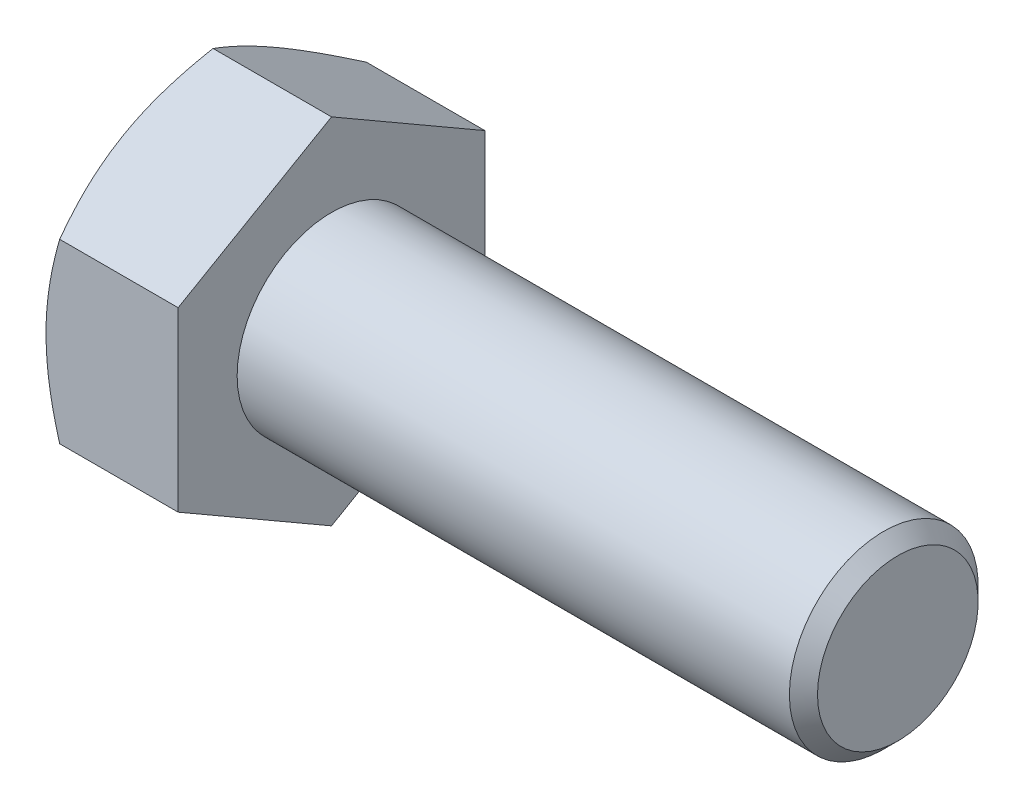
ISO-10303-21;
HEADER;
FILE_DESCRIPTION(('STEP AP214'),'2;1');
FILE_NAME('part.step','',(''),(''),'','','');
FILE_SCHEMA(('AUTOMOTIVE_DESIGN { 1 0 10303 214 1 1 1 1 }'));
ENDSEC;
DATA;
#1=APPLICATION_CONTEXT('core data for automotive mechanical design processes');
#2=APPLICATION_PROTOCOL_DEFINITION('international standard','automotive_design',2000,#1);
#3=PRODUCT_CONTEXT('',#1,'mechanical');
#4=PRODUCT('Part','Part','',(#3));
#5=PRODUCT_RELATED_PRODUCT_CATEGORY('part','',(#4));
#6=PRODUCT_DEFINITION_FORMATION('','',#4);
#7=PRODUCT_DEFINITION_CONTEXT('part definition',#1,'design');
#8=PRODUCT_DEFINITION('design','',#6,#7);
#9=PRODUCT_DEFINITION_SHAPE('','',#8);
#10=(LENGTH_UNIT() NAMED_UNIT(*) SI_UNIT(.MILLI.,.METRE.));
#11=(NAMED_UNIT(*) PLANE_ANGLE_UNIT() SI_UNIT($,.RADIAN.));
#12=(NAMED_UNIT(*) SI_UNIT($,.STERADIAN.) SOLID_ANGLE_UNIT());
#13=UNCERTAINTY_MEASURE_WITH_UNIT(LENGTH_MEASURE(1.E-05),#10,'distance_accuracy_value','');
#14=(GEOMETRIC_REPRESENTATION_CONTEXT(3) GLOBAL_UNCERTAINTY_ASSIGNED_CONTEXT((#13)) GLOBAL_UNIT_ASSIGNED_CONTEXT((#10,
#11,#12)) REPRESENTATION_CONTEXT('',''));
#15=CARTESIAN_POINT('',(0.,0.,0.));
#16=DIRECTION('',(0.,0.,1.));
#17=DIRECTION('',(1.,0.,0.));
#18=AXIS2_PLACEMENT_3D('',#15,#16,#17);
#19=CARTESIAN_POINT('',(-17.9582411472748,25.7612770285793,9.97950950033569));
#20=DIRECTION('',(0.,-0.866025403784438,0.500000000000001));
#21=DIRECTION('',(0.,-0.500000000000001,-0.866025403784438));
#22=AXIS2_PLACEMENT_3D('',#19,#20,#21);
#23=PLANE('',#22);
#24=CARTESIAN_POINT('',(-18.9542827835196,26.5059758817327,11.2693657503357));
#25=CARTESIAN_POINT('',(-18.973182209734,26.4732510725458,11.212684718156));
#26=CARTESIAN_POINT('',(-18.9903703010223,26.4402437835398,11.1555144165775));
#27=CARTESIAN_POINT('',(-19.0203717180975,26.3736576964694,11.0401839306944));
#28=CARTESIAN_POINT('',(-19.0331744314711,26.3400777156107,10.9820216977298));
#29=CARTESIAN_POINT('',(-19.0531029419838,26.2733338974192,10.8664180135311));
#30=CARTESIAN_POINT('',(-19.0603613870872,26.2401803270976,10.8089943452818));
#31=CARTESIAN_POINT('',(-19.0690251190552,26.1737172550244,10.6938769276239));
#32=CARTESIAN_POINT('',(-19.0704375816595,26.1404079947113,10.636183596399));
#33=CARTESIAN_POINT('',(-19.067492985651,26.0781722639128,10.5283881486098));
#34=CARTESIAN_POINT('',(-19.0638589233558,26.0492364583945,10.4782698632943));
#35=CARTESIAN_POINT('',(-19.0523430004584,25.9915533563113,10.378359799748));
#36=CARTESIAN_POINT('',(-19.0444572092083,25.9628062591346,10.3285683668678));
#37=CARTESIAN_POINT('',(-19.0247440970353,25.9050043070927,10.2284524491546));
#38=CARTESIAN_POINT('',(-19.0128332455615,25.8759567648255,10.1781406301129));
#39=CARTESIAN_POINT('',(-18.9858005866574,25.818294819866,10.0782672117797));
#40=CARTESIAN_POINT('',(-18.9706851274893,25.7896796789241,10.0287043338027));
#41=CARTESIAN_POINT('',(-18.9542827835196,25.7612698117009,9.97949700033569));
#42=B_SPLINE_CURVE_WITH_KNOTS('',3,(#24,#25,#26,#27,#28,#29,#30,#31,#32,#33,#34,#35,#36,#37,#38,
#39,#40,#41),.UNSPECIFIED.,.F.,.F.,(4,2,2,2,2,2,2,2,4),(0.,0.20445154883662,0.409394422295631,
0.609265498091623,0.808891166214447,0.98268264808685,1.15663507328004,1.33444512671532,
1.51190617946655),.UNSPECIFIED.);
#43=CARTESIAN_POINT('',(-18.9542869502165,26.5059686648543,11.2693532503357));
#44=VERTEX_POINT('',#43);
#45=CARTESIAN_POINT('',(-19.0694911472748,26.1336228467168,10.6244313753357));
#46=VERTEX_POINT('',#45);
#47=EDGE_CURVE('E59',#44,#46,#42,.T.);
#48=ORIENTED_EDGE('',*,*,#47,.F.);
#49=DIRECTION('',(-1.,0.,0.));
#50=VECTOR('',#49,1.);
#51=CARTESIAN_POINT('',(-17.9582411472748,26.5059686648543,11.2693532503357));
#52=LINE('',#51,#50);
#53=CARTESIAN_POINT('',(-17.9582411472748,26.5059686648543,11.2693532503357));
#54=VERTEX_POINT('',#53);
#55=EDGE_CURVE('E155',#54,#44,#52,.T.);
#56=ORIENTED_EDGE('',*,*,#55,.F.);
#57=DIRECTION('',(0.,0.500000000000001,0.866025403784438));
#58=VECTOR('',#57,1.);
#59=CARTESIAN_POINT('',(-17.9582411472748,25.7612770285793,9.97950950033569));
#60=LINE('',#59,#58);
#61=CARTESIAN_POINT('',(-17.9582411472748,25.7612770285793,9.97950950033569));
#62=VERTEX_POINT('',#61);
#63=EDGE_CURVE('E246',#62,#54,#60,.T.);
#64=ORIENTED_EDGE('',*,*,#63,.F.);
#65=DIRECTION('',(-1.,0.,0.));
#66=VECTOR('',#65,1.);
#67=CARTESIAN_POINT('',(-17.9582411472748,25.7612770285793,9.97950950033569));
#68=LINE('',#67,#66);
#69=CARTESIAN_POINT('',(-18.9542869502165,25.7612770285793,9.97950950033569));
#70=VERTEX_POINT('',#69);
#71=EDGE_CURVE('E143',#62,#70,#68,.T.);
#72=ORIENTED_EDGE('',*,*,#71,.T.);
#73=EDGE_CURVE('E137',#46,#70,#42,.T.);
#74=ORIENTED_EDGE('',*,*,#73,.F.);
#75=EDGE_LOOP('',(#48,#56,#64,#72,#74));
#76=FACE_BOUND('',#75,.T.);
#77=ADVANCED_FACE('F43',(#76),#23,.F.);
#78=CARTESIAN_POINT('',(-17.9582411472748,26.5059686648543,11.2693532503357));
#79=DIRECTION('',(0.,-0.866025403784438,-0.500000000000001));
#80=DIRECTION('',(0.,0.500000000000001,-0.866025403784438));
#81=AXIS2_PLACEMENT_3D('',#78,#79,#80);
#82=PLANE('',#81);
#83=CARTESIAN_POINT('',(-18.9542827835196,25.7612698117009,12.5592095003357));
#84=CARTESIAN_POINT('',(-18.973182209734,25.7939946208878,12.502528468156));
#85=CARTESIAN_POINT('',(-18.9903703010223,25.8270019098938,12.4453581665775));
#86=CARTESIAN_POINT('',(-19.0203717180975,25.8935879969642,12.3300276806944));
#87=CARTESIAN_POINT('',(-19.0331744314711,25.9271679778229,12.2718654477298));
#88=CARTESIAN_POINT('',(-19.0531029419838,25.9939117960144,12.1562617635311));
#89=CARTESIAN_POINT('',(-19.0603613870872,26.027065366336,12.0988380952818));
#90=CARTESIAN_POINT('',(-19.0690251190552,26.0935284384092,11.9837206776239));
#91=CARTESIAN_POINT('',(-19.0704375816595,26.1268376987223,11.926027346399));
#92=CARTESIAN_POINT('',(-19.067492985651,26.1890734295208,11.8182318986098));
#93=CARTESIAN_POINT('',(-19.0638589233558,26.218009235039,11.7681136132943));
#94=CARTESIAN_POINT('',(-19.0523430004584,26.2756923371223,11.668203549748));
#95=CARTESIAN_POINT('',(-19.0444572092083,26.3044394342989,11.6184121168678));
#96=CARTESIAN_POINT('',(-19.0247440970353,26.3622413863408,11.5182961991546));
#97=CARTESIAN_POINT('',(-19.0128332455615,26.391288928608,11.4679843801129));
#98=CARTESIAN_POINT('',(-18.9858005866574,26.4489508735676,11.3681109617797));
#99=CARTESIAN_POINT('',(-18.9706851274893,26.4775660145094,11.3185480838027));
#100=CARTESIAN_POINT('',(-18.9542827835196,26.5059758817327,11.2693407503357));
#101=B_SPLINE_CURVE_WITH_KNOTS('',3,(#83,#84,#85,#86,#87,#88,#89,#90,#91,#92,#93,#94,#95,#96,
#97,#98,#99,#100),.UNSPECIFIED.,.F.,.F.,(4,2,2,2,2,2,2,2,4),(0.,0.20445154883662,
0.409394422295631,0.609265498091621,0.808891166214447,0.982682648086853,1.15663507328004,
1.33444512671532,1.51190617946655),.UNSPECIFIED.);
#102=CARTESIAN_POINT('',(-18.9542869502165,25.7612770285793,12.5591970003357));
#103=VERTEX_POINT('',#102);
#104=CARTESIAN_POINT('',(-19.0694911472748,26.1336228467168,11.9142751253357));
#105=VERTEX_POINT('',#104);
#106=EDGE_CURVE('E66',#103,#105,#101,.T.);
#107=ORIENTED_EDGE('',*,*,#106,.F.);
#108=DIRECTION('',(-1.,0.,0.));
#109=VECTOR('',#108,1.);
#110=CARTESIAN_POINT('',(-17.9582411472748,25.7612770285793,12.5591970003357));
#111=LINE('',#110,#109);
#112=CARTESIAN_POINT('',(-17.9582411472748,25.7612770285793,12.5591970003357));
#113=VERTEX_POINT('',#112);
#114=EDGE_CURVE('E153',#113,#103,#111,.T.);
#115=ORIENTED_EDGE('',*,*,#114,.F.);
#116=DIRECTION('',(0.,-0.500000000000001,0.866025403784438));
#117=VECTOR('',#116,1.);
#118=CARTESIAN_POINT('',(-17.9582411472748,26.5059686648543,11.2693532503357));
#119=LINE('',#118,#117);
#120=EDGE_CURVE('E244',#54,#113,#119,.T.);
#121=ORIENTED_EDGE('',*,*,#120,.F.);
#122=ORIENTED_EDGE('',*,*,#55,.T.);
#123=EDGE_CURVE('E170',#105,#44,#101,.T.);
#124=ORIENTED_EDGE('',*,*,#123,.F.);
#125=EDGE_LOOP('',(#107,#115,#121,#122,#124));
#126=FACE_BOUND('',#125,.T.);
#127=ADVANCED_FACE('F176',(#126),#82,.F.);
#128=CARTESIAN_POINT('',(-17.9582411472748,25.7612770285793,12.5591970003357));
#129=DIRECTION('',(0.,0.,-1.));
#130=DIRECTION('',(0.,1.,0.));
#131=AXIS2_PLACEMENT_3D('',#128,#129,#130);
#132=PLANE('',#131);
#133=CARTESIAN_POINT('',(-18.4367806555294,23.0095943690528,12.5591970003357));
#134=CARTESIAN_POINT('',(-18.4641624222577,23.0659851563776,12.5591970003357));
#135=CARTESIAN_POINT('',(-18.4912828950423,23.1225047492026,12.5591970003357));
#136=CARTESIAN_POINT('',(-18.544856168958,23.2358698318332,12.5591970003357));
#137=CARTESIAN_POINT('',(-18.5713088661773,23.2927153706907,12.5591970003357));
#138=CARTESIAN_POINT('',(-18.6235331760912,23.407090345644,12.5591970003357));
#139=CARTESIAN_POINT('',(-18.6493003541879,23.4646218160976,12.5591970003357));
#140=CARTESIAN_POINT('',(-18.6997837281147,23.5801405853988,12.5591970003357));
#141=CARTESIAN_POINT('',(-18.7244999731437,23.6381278627572,12.5591970003357));
#142=CARTESIAN_POINT('',(-18.7982640321426,23.8167000396442,12.5591970003357));
#143=CARTESIAN_POINT('',(-18.845189237228,23.9381765987464,12.5591970003357));
#144=CARTESIAN_POINT('',(-18.9297189817609,24.1842024712746,12.5591970003357));
#145=CARTESIAN_POINT('',(-18.9673449327969,24.3087439860076,12.5591970003357));
#146=CARTESIAN_POINT('',(-19.0122251877427,24.4979666019715,12.5591970003357));
#147=CARTESIAN_POINT('',(-19.0252385764685,24.5612635665357,12.5591970003357));
#148=CARTESIAN_POINT('',(-19.0466058783075,24.6886535404552,12.5591970003357));
#149=CARTESIAN_POINT('',(-19.0549602426008,24.7527464721143,12.5591970003357));
#150=CARTESIAN_POINT('',(-19.0662366947289,24.8805678667418,12.5591970003357));
#151=CARTESIAN_POINT('',(-19.0692291254048,24.9442899495722,12.5591970003357));
#152=CARTESIAN_POINT('',(-19.0697203433056,25.0717535191487,12.5591970003357));
#153=CARTESIAN_POINT('',(-19.0672190454812,25.1354950061799,12.5591970003357));
#154=CARTESIAN_POINT('',(-19.0548780520311,25.2880220580956,12.5591970003357));
#155=CARTESIAN_POINT('',(-19.0424984631109,25.3766035024838,12.5591970003357));
#156=CARTESIAN_POINT('',(-19.0092791663275,25.5521682449576,12.5591970003357));
#157=CARTESIAN_POINT('',(-18.9884312801053,25.6391499129164,12.5591970003357));
#158=CARTESIAN_POINT('',(-18.9400291626214,25.8132628703073,12.5591970003357));
#159=CARTESIAN_POINT('',(-18.9123362076451,25.9003545377735,12.5591970003357));
#160=CARTESIAN_POINT('',(-18.8524501958411,26.0729178693201,12.5591970003357));
#161=CARTESIAN_POINT('',(-18.8202583360132,26.1583899574665,12.5591970003357));
#162=CARTESIAN_POINT('',(-18.7401250092068,26.3598181582425,12.5591970003357));
#163=CARTESIAN_POINT('',(-18.6907967996143,26.4752168235431,12.5591970003357));
#164=CARTESIAN_POINT('',(-18.5884684420932,26.7043851786515,12.5591970003357));
#165=CARTESIAN_POINT('',(-18.5354672667047,26.8181544018189,12.5591970003357));
#166=CARTESIAN_POINT('',(-18.4270075771553,27.0446550645807,12.5591970003357));
#167=CARTESIAN_POINT('',(-18.3715465640183,27.1573853014637,12.5591970003357));
#168=CARTESIAN_POINT('',(-18.2589869316113,27.3820260214066,12.5591970003357));
#169=CARTESIAN_POINT('',(-18.2018882553363,27.4939364757604,12.5591970003357));
#170=CARTESIAN_POINT('',(-18.091407890427,27.7077249489886,12.5591970003357));
#171=CARTESIAN_POINT('',(-18.0381198995736,27.809651513679,12.5591970003357));
#172=CARTESIAN_POINT('',(-17.9308143989339,28.0131240960407,12.5591970003357));
#173=CARTESIAN_POINT('',(-17.8767968627153,28.1146700997527,12.5591970003357));
#174=CARTESIAN_POINT('',(-17.7683441364752,28.3172072935981,12.5591970003357));
#175=CARTESIAN_POINT('',(-17.7139103524296,28.4181992376319,12.5591970003357));
#176=CARTESIAN_POINT('',(-17.604607222316,28.6199398950491,12.5591970003357));
#177=CARTESIAN_POINT('',(-17.5497379009506,28.7206886218102,12.5591970003357));
#178=CARTESIAN_POINT('',(-17.4947061984989,28.8213479323828,12.5591970003357));
#179=B_SPLINE_CURVE_WITH_KNOTS('',3,(#133,#134,#135,#136,#137,#138,#139,#140,#141,#142,#143,
#144,#145,#146,#147,#148,#149,#150,#151,#152,#153,#154,#155,#156,#157,#158,#159,#160,#161,#162,
#163,#164,#165,#166,#167,#168,#169,#170,#171,#172,#173,#174,#175,#176,#177,#178),.UNSPECIFIED.,
.F.,.F.,(4,2,2,2,2,2,2,2,2,2,2,2,2,2,2,2,2,2,2,2,2,2,4),(0.,0.188063332660333,0.376155751463754,
0.56526102388111,0.754357433678006,1.1448545208351,1.53444392959703,1.72816636991942,
1.92187004689328,2.11301339892068,2.30415971009012,2.57193443501784,2.83996838377787,
3.11395813598173,3.38787512748528,3.76426146091596,4.14075351141573,4.51763722108039,
4.89453406553246,5.23957776469025,5.5846339989257,5.92881546836756,6.27297755428258),.UNSPECIFIED.);
#180=CARTESIAN_POINT('',(-18.9542869502165,24.2718937560291,12.5591970003357));
#181=VERTEX_POINT('',#180);
#182=CARTESIAN_POINT('',(-19.0694911472748,25.0165853923042,12.5591970003357));
#183=VERTEX_POINT('',#182);
#184=EDGE_CURVE('E256',#181,#183,#179,.T.);
#185=ORIENTED_EDGE('',*,*,#184,.F.);
#186=DIRECTION('',(-1.,0.,0.));
#187=VECTOR('',#186,1.);
#188=CARTESIAN_POINT('',(-17.9582411472748,24.2718937560291,12.5591970003357));
#189=LINE('',#188,#187);
#190=CARTESIAN_POINT('',(-17.9582411472748,24.2718937560291,12.5591970003357));
#191=VERTEX_POINT('',#190);
#192=EDGE_CURVE('E145',#191,#181,#189,.T.);
#193=ORIENTED_EDGE('',*,*,#192,.F.);
#194=DIRECTION('',(0.,-1.,0.));
#195=VECTOR('',#194,1.);
#196=CARTESIAN_POINT('',(-17.9582411472748,25.7612770285793,12.5591970003357));
#197=LINE('',#196,#195);
#198=EDGE_CURVE('E240',#113,#191,#197,.T.);
#199=ORIENTED_EDGE('',*,*,#198,.F.);
#200=ORIENTED_EDGE('',*,*,#114,.T.);
#201=EDGE_CURVE('E194',#183,#103,#179,.T.);
#202=ORIENTED_EDGE('',*,*,#201,.F.);
#203=EDGE_LOOP('',(#185,#193,#199,#200,#202));
#204=FACE_BOUND('',#203,.T.);
#205=ADVANCED_FACE('F262',(#204),#132,.F.);
#206=CARTESIAN_POINT('',(-17.9582411472748,23.5272021197541,11.2693532503357));
#207=DIRECTION('',(0.,0.866025403784438,-0.500000000000002));
#208=DIRECTION('',(0.,0.500000000000002,0.866025403784438));
#209=AXIS2_PLACEMENT_3D('',#206,#207,#208);
#210=PLANE('',#209);
#211=CARTESIAN_POINT('',(-18.9542827835196,23.5271949028757,11.2693407503357));
#212=CARTESIAN_POINT('',(-18.973182209734,23.5599197120626,11.3260217825154));
#213=CARTESIAN_POINT('',(-18.9903703010223,23.5929270010686,11.3831920840939));
#214=CARTESIAN_POINT('',(-19.0203717180975,23.659513088139,11.498522569977));
#215=CARTESIAN_POINT('',(-19.0331744314711,23.6930930689977,11.5566848029415));
#216=CARTESIAN_POINT('',(-19.0531029419838,23.7598368871892,11.6722884871403));
#217=CARTESIAN_POINT('',(-19.0603613870872,23.7929904575108,11.7297121553896));
#218=CARTESIAN_POINT('',(-19.0690251190552,23.859453529584,11.8448295730475));
#219=CARTESIAN_POINT('',(-19.0704375816595,23.8927627898971,11.9025229042724));
#220=CARTESIAN_POINT('',(-19.067492985651,23.9549985206956,12.0103183520615));
#221=CARTESIAN_POINT('',(-19.0638589233558,23.9839343262138,12.060436637377));
#222=CARTESIAN_POINT('',(-19.0523430004584,24.0416174282971,12.1603467009234));
#223=CARTESIAN_POINT('',(-19.0444572092083,24.0703645254738,12.2101381338035));
#224=CARTESIAN_POINT('',(-19.0247440970353,24.1281664775157,12.3102540515168));
#225=CARTESIAN_POINT('',(-19.0128332455615,24.1572140197828,12.3605658705585));
#226=CARTESIAN_POINT('',(-18.9858005866574,24.2148759647424,12.4604392888917));
#227=CARTESIAN_POINT('',(-18.9706851274893,24.2434911056842,12.5100021668687));
#228=CARTESIAN_POINT('',(-18.9542827835196,24.2719009729075,12.5592095003357));
#229=B_SPLINE_CURVE_WITH_KNOTS('',3,(#211,#212,#213,#214,#215,#216,#217,#218,#219,#220,#221,
#222,#223,#224,#225,#226,#227,#228),.UNSPECIFIED.,.F.,.F.,(4,2,2,2,2,2,2,2,4),(0.,
0.204451548836619,0.409394422295633,0.609265498091623,0.808891166214446,0.98268264808685,
1.15663507328004,1.33444512671532,1.51190617946655),.UNSPECIFIED.);
#230=CARTESIAN_POINT('',(-18.9542869502165,23.5272021197541,11.2693532503357));
#231=VERTEX_POINT('',#230);
#232=CARTESIAN_POINT('',(-19.0694911472748,23.8995479378916,11.9142751253357));
#233=VERTEX_POINT('',#232);
#234=EDGE_CURVE('E178',#231,#233,#229,.T.);
#235=ORIENTED_EDGE('',*,*,#234,.F.);
#236=DIRECTION('',(-1.,0.,0.));
#237=VECTOR('',#236,1.);
#238=CARTESIAN_POINT('',(-17.9582411472748,23.5272021197541,11.2693532503357));
#239=LINE('',#238,#237);
#240=CARTESIAN_POINT('',(-17.9582411472748,23.5272021197541,11.2693532503357));
#241=VERTEX_POINT('',#240);
#242=EDGE_CURVE('E142',#241,#231,#239,.T.);
#243=ORIENTED_EDGE('',*,*,#242,.F.);
#244=DIRECTION('',(0.,-0.500000000000002,-0.866025403784438));
#245=VECTOR('',#244,1.);
#246=CARTESIAN_POINT('',(-17.9582411472748,23.5272021197541,11.2693532503357));
#247=LINE('',#246,#245);
#248=EDGE_CURVE('E238',#191,#241,#247,.T.);
#249=ORIENTED_EDGE('',*,*,#248,.F.);
#250=ORIENTED_EDGE('',*,*,#192,.T.);
#251=EDGE_CURVE('E180',#233,#181,#229,.T.);
#252=ORIENTED_EDGE('',*,*,#251,.F.);
#253=EDGE_LOOP('',(#235,#243,#249,#250,#252));
#254=FACE_BOUND('',#253,.T.);
#255=ADVANCED_FACE('F234',(#254),#210,.F.);
#256=CARTESIAN_POINT('',(-17.9582411472748,24.2718937560291,9.97950950033569));
#257=DIRECTION('',(0.,0.866025403784439,0.499999999999999));
#258=DIRECTION('',(0.,-0.5,0.866025403784439));
#259=AXIS2_PLACEMENT_3D('',#256,#257,#258);
#260=PLANE('',#259);
#261=CARTESIAN_POINT('',(-18.9542827835196,24.2719009729075,9.97949700033569));
#262=CARTESIAN_POINT('',(-18.973182209734,24.2391761637206,10.0361780325154));
#263=CARTESIAN_POINT('',(-18.9903703010223,24.2061688747146,10.0933483340939));
#264=CARTESIAN_POINT('',(-19.0203717180975,24.1395827876442,10.208678819977));
#265=CARTESIAN_POINT('',(-19.0331744314711,24.1060028067855,10.2668410529415));
#266=CARTESIAN_POINT('',(-19.0531029419838,24.039258988594,10.3824447371403));
#267=CARTESIAN_POINT('',(-19.0603613870872,24.0061054182724,10.4398684053896));
#268=CARTESIAN_POINT('',(-19.0690251190552,23.9396423461992,10.5549858230475));
#269=CARTESIAN_POINT('',(-19.0704375816595,23.9063330858861,10.6126791542724));
#270=CARTESIAN_POINT('',(-19.067492985651,23.8440973550876,10.7204746020615));
#271=CARTESIAN_POINT('',(-19.0638589233558,23.8151615495694,10.770592887377));
#272=CARTESIAN_POINT('',(-19.0523430004584,23.7574784474861,10.8705029509234));
#273=CARTESIAN_POINT('',(-19.0444572092083,23.7287313503094,10.9202943838035));
#274=CARTESIAN_POINT('',(-19.0247440970353,23.6709293982675,11.0204103015168));
#275=CARTESIAN_POINT('',(-19.0128332455615,23.6418818560004,11.0707221205585));
#276=CARTESIAN_POINT('',(-18.9858005866574,23.5842199110408,11.1705955388917));
#277=CARTESIAN_POINT('',(-18.9706851274893,23.555604770099,11.2201584168687));
#278=CARTESIAN_POINT('',(-18.9542827835196,23.5271949028757,11.2693657503357));
#279=B_SPLINE_CURVE_WITH_KNOTS('',3,(#261,#262,#263,#264,#265,#266,#267,#268,#269,#270,#271,
#272,#273,#274,#275,#276,#277,#278),.UNSPECIFIED.,.F.,.F.,(4,2,2,2,2,2,2,2,4),(0.,
0.204451548836619,0.40939442229563,0.609265498091626,0.808891166214447,0.982682648086853,
1.15663507328004,1.33444512671532,1.51190617946655),.UNSPECIFIED.);
#280=CARTESIAN_POINT('',(-18.9542869502165,24.2718937560291,9.97950950033569));
#281=VERTEX_POINT('',#280);
#282=CARTESIAN_POINT('',(-19.0694911472748,23.8995479378916,10.6244313753357));
#283=VERTEX_POINT('',#282);
#284=EDGE_CURVE('E119',#281,#283,#279,.T.);
#285=ORIENTED_EDGE('',*,*,#284,.F.);
#286=DIRECTION('',(-1.,0.,0.));
#287=VECTOR('',#286,1.);
#288=CARTESIAN_POINT('',(-17.9582411472748,24.2718937560291,9.97950950033569));
#289=LINE('',#288,#287);
#290=CARTESIAN_POINT('',(-17.9582411472748,24.2718937560291,9.97950950033569));
#291=VERTEX_POINT('',#290);
#292=EDGE_CURVE('E133',#291,#281,#289,.T.);
#293=ORIENTED_EDGE('',*,*,#292,.F.);
#294=DIRECTION('',(0.,0.499999999999999,-0.866025403784439));
#295=VECTOR('',#294,1.);
#296=CARTESIAN_POINT('',(-17.9582411472748,24.2718937560291,9.97950950033569));
#297=LINE('',#296,#295);
#298=EDGE_CURVE('E236',#241,#291,#297,.T.);
#299=ORIENTED_EDGE('',*,*,#298,.F.);
#300=ORIENTED_EDGE('',*,*,#242,.T.);
#301=EDGE_CURVE('E136',#283,#231,#279,.T.);
#302=ORIENTED_EDGE('',*,*,#301,.F.);
#303=EDGE_LOOP('',(#285,#293,#299,#300,#302));
#304=FACE_BOUND('',#303,.T.);
#305=ADVANCED_FACE('F131',(#304),#260,.F.);
#306=CARTESIAN_POINT('',(-17.9582411472748,25.7612770285793,9.97950950033569));
#307=DIRECTION('',(0.,0.,1.));
#308=DIRECTION('',(0.,-1.,0.));
#309=AXIS2_PLACEMENT_3D('',#306,#307,#308);
#310=PLANE('',#309);
#311=CARTESIAN_POINT('',(-18.4367806554754,23.0095943689417,9.97950950033569));
#312=CARTESIAN_POINT('',(-18.464162422206,23.0659851562703,9.97950950033569));
#313=CARTESIAN_POINT('',(-18.4912828949928,23.1225047490989,9.97950950033569));
#314=CARTESIAN_POINT('',(-18.544856168913,23.2358698317371,9.97950950033569));
#315=CARTESIAN_POINT('',(-18.5713088661346,23.2927153705983,9.97950950033569));
#316=CARTESIAN_POINT('',(-18.623533176053,23.4070903455592,9.97950950033569));
#317=CARTESIAN_POINT('',(-18.6493003541519,23.4646218160166,9.97950950033569));
#318=CARTESIAN_POINT('',(-18.6997837280832,23.5801405853254,9.97950950033569));
#319=CARTESIAN_POINT('',(-18.7244999731144,23.6381278626876,9.97950950033569));
#320=CARTESIAN_POINT('',(-18.7982640321201,23.8167000395866,9.97950950033569));
#321=CARTESIAN_POINT('',(-18.8451892372099,23.9381765986972,9.97950950033569));
#322=CARTESIAN_POINT('',(-18.929718981751,24.1842024712423,9.97950950033569));
#323=CARTESIAN_POINT('',(-18.9673449327907,24.308743985984,9.97950950033569));
#324=CARTESIAN_POINT('',(-19.0122251877411,24.4979666019633,9.97950950033569));
#325=CARTESIAN_POINT('',(-19.0252385764684,24.5612635665342,9.97950950033569));
#326=CARTESIAN_POINT('',(-19.0466058783094,24.6886535404673,9.97950950033569));
#327=CARTESIAN_POINT('',(-19.0549602426032,24.7527464721332,9.97950950033569));
#328=CARTESIAN_POINT('',(-19.0662366947311,24.8805678667743,9.97950950033569));
#329=CARTESIAN_POINT('',(-19.0692291254063,24.9442899496115,9.97950950033569));
#330=CARTESIAN_POINT('',(-19.0697203433045,25.0717535192013,9.97950950033569));
#331=CARTESIAN_POINT('',(-19.0672190454782,25.1354950062391,9.97950950033569));
#332=CARTESIAN_POINT('',(-19.054878052023,25.2880220581651,9.97950950033569));
#333=CARTESIAN_POINT('',(-19.0424984630996,25.3766035025568,9.97950950033569));
#334=CARTESIAN_POINT('',(-19.0092791663099,25.5521682450374,9.97950950033569));
#335=CARTESIAN_POINT('',(-18.9884312800845,25.6391499129995,9.97950950033569));
#336=CARTESIAN_POINT('',(-18.9400291625942,25.813262870397,9.97950950033569));
#337=CARTESIAN_POINT('',(-18.9123362076148,25.9003545378665,9.97950950033569));
#338=CARTESIAN_POINT('',(-18.8524501958047,26.0729178694196,9.97950950033569));
#339=CARTESIAN_POINT('',(-18.8202583359738,26.1583899575693,9.97950950033569));
#340=CARTESIAN_POINT('',(-18.7401250091629,26.3598181583476,9.97950950033569));
#341=CARTESIAN_POINT('',(-18.6907967995691,26.4752168236473,9.97950950033569));
#342=CARTESIAN_POINT('',(-18.588468442046,26.7043851787541,9.97950950033569));
#343=CARTESIAN_POINT('',(-18.5354672666568,26.8181544019208,9.97950950033569));
#344=CARTESIAN_POINT('',(-18.4270075771062,27.0446550646812,9.97950950033569));
#345=CARTESIAN_POINT('',(-18.3715465639689,27.1573853015636,9.97950950033569));
#346=CARTESIAN_POINT('',(-18.2589869315612,27.3820260215053,9.97950950033569));
#347=CARTESIAN_POINT('',(-18.201888255286,27.4939364758585,9.97950950033569));
#348=CARTESIAN_POINT('',(-18.0914078903762,27.7077249490862,9.97950950033569));
#349=CARTESIAN_POINT('',(-18.0381198995225,27.8096515137765,9.97950950033569));
#350=CARTESIAN_POINT('',(-17.9308143988822,28.0131240961381,9.97950950033569));
#351=CARTESIAN_POINT('',(-17.8767968626634,28.11467009985,9.97950950033569));
#352=CARTESIAN_POINT('',(-17.7683441364229,28.3172072936954,9.97950950033569));
#353=CARTESIAN_POINT('',(-17.713910352377,28.4181992377293,9.97950950033569));
#354=CARTESIAN_POINT('',(-17.604607222263,28.6199398951465,9.97950950033569));
#355=CARTESIAN_POINT('',(-17.5497379008974,28.7206886219077,9.97950950033569));
#356=CARTESIAN_POINT('',(-17.4947061984456,28.8213479324803,9.97950950033569));
#357=B_SPLINE_CURVE_WITH_KNOTS('',3,(#311,#312,#313,#314,#315,#316,#317,#318,#319,#320,#321,
#322,#323,#324,#325,#326,#327,#328,#329,#330,#331,#332,#333,#334,#335,#336,#337,#338,#339,#340,
#341,#342,#343,#344,#345,#346,#347,#348,#349,#350,#351,#352,#353,#354,#355,#356),.UNSPECIFIED.,
.F.,.F.,(4,2,2,2,2,2,2,2,2,2,2,2,2,2,2,2,2,2,2,2,2,2,4),(0.,0.188063332673362,0.376155751489816,
0.565261023920337,0.754357433730415,1.14485452091553,1.53444392970535,1.72816637004828,
1.92187004704263,2.11301339909004,2.3041597102795,2.57193443521902,2.83996838399088,
3.11395813620706,3.3878751277229,3.76426146115259,4.14075351165134,4.51763722131489,
4.89453406576583,5.23957776492382,5.58463399915947,5.92881546860175,6.27297755451718),.UNSPECIFIED.);
#358=CARTESIAN_POINT('',(-19.0694911472748,25.0165853923042,9.97950950033569));
#359=VERTEX_POINT('',#358);
#360=EDGE_CURVE('E125',#70,#359,#357,.F.);
#361=ORIENTED_EDGE('',*,*,#360,.F.);
#362=ORIENTED_EDGE('',*,*,#71,.F.);
#363=DIRECTION('',(0.,1.,0.));
#364=VECTOR('',#363,1.);
#365=CARTESIAN_POINT('',(-17.9582411472748,25.7612770285793,9.97950950033569));
#366=LINE('',#365,#364);
#367=EDGE_CURVE('E141',#291,#62,#366,.T.);
#368=ORIENTED_EDGE('',*,*,#367,.F.);
#369=ORIENTED_EDGE('',*,*,#292,.T.);
#370=EDGE_CURVE('E116',#359,#281,#357,.F.);
#371=ORIENTED_EDGE('',*,*,#370,.F.);
#372=EDGE_LOOP('',(#361,#362,#368,#369,#371));
#373=FACE_BOUND('',#372,.T.);
#374=ADVANCED_FACE('F139',(#373),#310,.F.);
#375=CARTESIAN_POINT('',(-17.9582411472748,26.5059686648543,11.2693532503357));
#376=DIRECTION('',(1.,0.,0.));
#377=DIRECTION('',(0.,0.,-1.));
#378=AXIS2_PLACEMENT_3D('',#375,#376,#377);
#379=PLANE('',#378);
#380=CARTESIAN_POINT('',(-17.9582411472748,25.0165853923042,11.2693532503357));
#381=DIRECTION('',(1.,0.,0.));
#382=DIRECTION('',(0.,0.,-1.));
#383=AXIS2_PLACEMENT_3D('',#380,#381,#382);
#384=CIRCLE('',#383,0.79375);
#385=CARTESIAN_POINT('',(-17.9582411472748,25.0165853923042,10.4756032503357));
#386=VERTEX_POINT('',#385);
#387=EDGE_CURVE('E249',#386,#386,#384,.F.);
#388=ORIENTED_EDGE('',*,*,#387,.T.);
#389=EDGE_LOOP('',(#388));
#390=FACE_BOUND('',#389,.T.);
#391=ORIENTED_EDGE('',*,*,#63,.T.);
#392=ORIENTED_EDGE('',*,*,#120,.T.);
#393=ORIENTED_EDGE('',*,*,#198,.T.);
#394=ORIENTED_EDGE('',*,*,#248,.T.);
#395=ORIENTED_EDGE('',*,*,#298,.T.);
#396=ORIENTED_EDGE('',*,*,#367,.T.);
#397=EDGE_LOOP('',(#391,#392,#393,#394,#395,#396));
#398=FACE_BOUND('',#397,.T.);
#399=ADVANCED_FACE('F264',(#390,#398),#379,.T.);
#400=CARTESIAN_POINT('',(-19.0694911472748,25.0165853923042,11.2693532503357));
#401=DIRECTION('',(-1.,0.,0.));
#402=DIRECTION('',(0.,0.,1.));
#403=AXIS2_PLACEMENT_3D('',#400,#401,#402);
#404=CYLINDRICAL_SURFACE('',#403,0.79375);
#405=ORIENTED_EDGE('',*,*,#387,.F.);
#406=EDGE_LOOP('',(#405));
#407=FACE_BOUND('',#406,.T.);
#408=CARTESIAN_POINT('',(-13.3140098972748,25.0165853923042,11.2693532503357));
#409=DIRECTION('',(-1.,0.,0.));
#410=DIRECTION('',(0.,0.,1.));
#411=AXIS2_PLACEMENT_3D('',#408,#409,#410);
#412=CIRCLE('',#411,0.79375);
#413=CARTESIAN_POINT('',(-13.3140098972748,25.0165853923042,12.0631032503357));
#414=VERTEX_POINT('',#413);
#415=EDGE_CURVE('E252',#414,#414,#412,.T.);
#416=ORIENTED_EDGE('',*,*,#415,.T.);
#417=EDGE_LOOP('',(#416));
#418=FACE_BOUND('',#417,.T.);
#419=ADVANCED_FACE('F295',(#407,#418),#404,.T.);
#420=CARTESIAN_POINT('',(-13.1957411472748,25.0165853923042,11.2693532503357));
#421=DIRECTION('',(-1.,0.,0.));
#422=DIRECTION('',(0.,0.,1.));
#423=AXIS2_PLACEMENT_3D('',#420,#421,#422);
#424=CONICAL_SURFACE('',#423,0.67548125,0.785398163397437);
#425=ORIENTED_EDGE('',*,*,#415,.F.);
#426=EDGE_LOOP('',(#425));
#427=FACE_BOUND('',#426,.T.);
#428=CARTESIAN_POINT('',(-13.1957411472748,25.0165853923042,11.2693532503357));
#429=DIRECTION('',(-1.,0.,0.));
#430=DIRECTION('',(0.,0.,1.));
#431=AXIS2_PLACEMENT_3D('',#428,#429,#430);
#432=CIRCLE('',#431,0.67548125);
#433=CARTESIAN_POINT('',(-13.1957411472748,25.0165853923042,11.9448345003357));
#434=VERTEX_POINT('',#433);
#435=EDGE_CURVE('E254',#434,#434,#432,.T.);
#436=ORIENTED_EDGE('',*,*,#435,.T.);
#437=EDGE_LOOP('',(#436));
#438=FACE_BOUND('',#437,.T.);
#439=ADVANCED_FACE('F298',(#427,#438),#424,.T.);
#440=CARTESIAN_POINT('',(-13.1957411472748,25.0165853923042,11.2693532503357));
#441=DIRECTION('',(-1.,0.,0.));
#442=DIRECTION('',(0.,0.,1.));
#443=AXIS2_PLACEMENT_3D('',#440,#441,#442);
#444=PLANE('',#443);
#445=ORIENTED_EDGE('',*,*,#435,.F.);
#446=EDGE_LOOP('',(#445));
#447=FACE_BOUND('',#446,.T.);
#448=ADVANCED_FACE('F208',(#447),#444,.F.);
#449=CARTESIAN_POINT('',(-19.0694911472748,25.0165853923042,11.2693532503357));
#450=DIRECTION('',(1.,0.,0.));
#451=DIRECTION('',(0.,0.,-1.));
#452=AXIS2_PLACEMENT_3D('',#449,#450,#451);
#453=CONICAL_SURFACE('',#452,1.28984375,1.0471975511966);
#454=ORIENTED_EDGE('',*,*,#284,.T.);
#455=CARTESIAN_POINT('',(-19.0694911472748,25.0165853923042,11.2693532503357));
#456=DIRECTION('',(1.,0.,0.));
#457=DIRECTION('',(0.,0.,-1.));
#458=AXIS2_PLACEMENT_3D('',#455,#456,#457);
#459=CIRCLE('',#458,1.28984375);
#460=EDGE_CURVE('E47',#283,#359,#459,.T.);
#461=ORIENTED_EDGE('',*,*,#460,.T.);
#462=ORIENTED_EDGE('',*,*,#370,.T.);
#463=EDGE_LOOP('',(#454,#461,#462));
#464=FACE_BOUND('',#463,.T.);
#465=ADVANCED_FACE('F118',(#464),#453,.T.);
#466=ORIENTED_EDGE('',*,*,#234,.T.);
#467=EDGE_CURVE('E160',#233,#283,#459,.T.);
#468=ORIENTED_EDGE('',*,*,#467,.T.);
#469=ORIENTED_EDGE('',*,*,#301,.T.);
#470=EDGE_LOOP('',(#466,#468,#469));
#471=FACE_BOUND('',#470,.T.);
#472=ADVANCED_FACE('F207',(#471),#453,.T.);
#473=ORIENTED_EDGE('',*,*,#184,.T.);
#474=EDGE_CURVE('E161',#183,#233,#459,.T.);
#475=ORIENTED_EDGE('',*,*,#474,.T.);
#476=ORIENTED_EDGE('',*,*,#251,.T.);
#477=EDGE_LOOP('',(#473,#475,#476));
#478=FACE_BOUND('',#477,.T.);
#479=ADVANCED_FACE('F202',(#478),#453,.T.);
#480=ORIENTED_EDGE('',*,*,#201,.T.);
#481=ORIENTED_EDGE('',*,*,#106,.T.);
#482=CARTESIAN_POINT('',(-19.0694911472748,25.0165853923042,11.2693532503357));
#483=DIRECTION('',(-1.,0.,0.));
#484=DIRECTION('',(0.,0.,1.));
#485=AXIS2_PLACEMENT_3D('',#482,#483,#484);
#486=CIRCLE('',#485,1.28984375);
#487=EDGE_CURVE('E126',#183,#105,#486,.T.);
#488=ORIENTED_EDGE('',*,*,#487,.F.);
#489=EDGE_LOOP('',(#480,#481,#488));
#490=FACE_BOUND('',#489,.T.);
#491=ADVANCED_FACE('F206',(#490),#453,.T.);
#492=ORIENTED_EDGE('',*,*,#123,.T.);
#493=ORIENTED_EDGE('',*,*,#47,.T.);
#494=EDGE_CURVE('E52',#46,#105,#459,.T.);
#495=ORIENTED_EDGE('',*,*,#494,.T.);
#496=EDGE_LOOP('',(#492,#493,#495));
#497=FACE_BOUND('',#496,.T.);
#498=ADVANCED_FACE('F169',(#497),#453,.T.);
#499=ORIENTED_EDGE('',*,*,#73,.T.);
#500=ORIENTED_EDGE('',*,*,#360,.T.);
#501=EDGE_CURVE('E11',#359,#46,#459,.T.);
#502=ORIENTED_EDGE('',*,*,#501,.T.);
#503=EDGE_LOOP('',(#499,#500,#502));
#504=FACE_BOUND('',#503,.T.);
#505=ADVANCED_FACE('F267',(#504),#453,.T.);
#506=CARTESIAN_POINT('',(-19.0694911472748,26.5059686648543,11.2693532503357));
#507=DIRECTION('',(1.,0.,0.));
#508=DIRECTION('',(0.,0.,-1.));
#509=AXIS2_PLACEMENT_3D('',#506,#507,#508);
#510=PLANE('',#509);
#511=ORIENTED_EDGE('',*,*,#501,.F.);
#512=ORIENTED_EDGE('',*,*,#460,.F.);
#513=ORIENTED_EDGE('',*,*,#467,.F.);
#514=ORIENTED_EDGE('',*,*,#474,.F.);
#515=ORIENTED_EDGE('',*,*,#487,.T.);
#516=ORIENTED_EDGE('',*,*,#494,.F.);
#517=EDGE_LOOP('',(#511,#512,#513,#514,#515,#516));
#518=FACE_BOUND('',#517,.T.);
#519=ADVANCED_FACE('F173',(#518),#510,.F.);
#520=CLOSED_SHELL('',(#77,#127,#205,#255,#305,#374,#399,#419,#439,#448,#465,#472,#479,#491,#498,
#505,#519));
#521=MANIFOLD_SOLID_BREP('B2',#520);
#522=ADVANCED_BREP_SHAPE_REPRESENTATION('',(#18,#521),#14);
#523=SHAPE_DEFINITION_REPRESENTATION(#9,#522);
ENDSEC;
END-ISO-10303-21;
